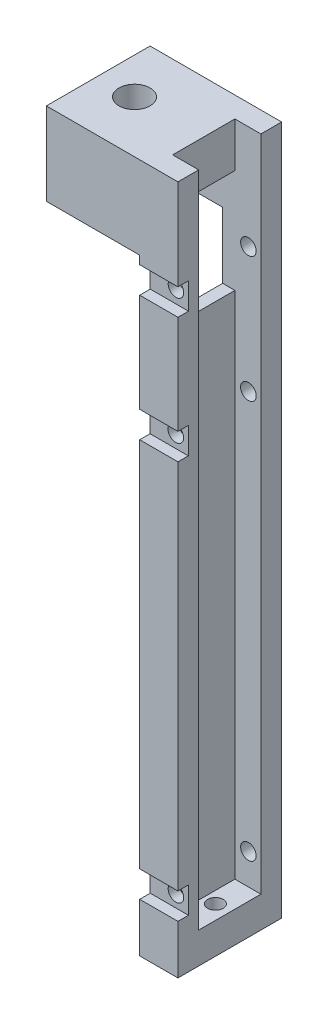
ISO-10303-21;
HEADER;
FILE_DESCRIPTION(('STEP AP214'),'2;1');
FILE_NAME('part.step','',(''),(''),'','','');
FILE_SCHEMA(('AUTOMOTIVE_DESIGN { 1 0 10303 214 1 1 1 1 }'));
ENDSEC;
DATA;
#1=APPLICATION_CONTEXT('core data for automotive mechanical design processes');
#2=APPLICATION_PROTOCOL_DEFINITION('international standard','automotive_design',2000,#1);
#3=PRODUCT_CONTEXT('',#1,'mechanical');
#4=PRODUCT('Part','Part','',(#3));
#5=PRODUCT_RELATED_PRODUCT_CATEGORY('part','',(#4));
#6=PRODUCT_DEFINITION_FORMATION('','',#4);
#7=PRODUCT_DEFINITION_CONTEXT('part definition',#1,'design');
#8=PRODUCT_DEFINITION('design','',#6,#7);
#9=PRODUCT_DEFINITION_SHAPE('','',#8);
#10=(LENGTH_UNIT() NAMED_UNIT(*) SI_UNIT(.MILLI.,.METRE.));
#11=(NAMED_UNIT(*) PLANE_ANGLE_UNIT() SI_UNIT($,.RADIAN.));
#12=(NAMED_UNIT(*) SI_UNIT($,.STERADIAN.) SOLID_ANGLE_UNIT());
#13=UNCERTAINTY_MEASURE_WITH_UNIT(LENGTH_MEASURE(1.E-05),#10,'distance_accuracy_value','');
#14=(GEOMETRIC_REPRESENTATION_CONTEXT(3) GLOBAL_UNCERTAINTY_ASSIGNED_CONTEXT((#13)) GLOBAL_UNIT_ASSIGNED_CONTEXT((#10,
#11,#12)) REPRESENTATION_CONTEXT('',''));
#15=CARTESIAN_POINT('',(0.,0.,0.));
#16=DIRECTION('',(0.,0.,1.));
#17=DIRECTION('',(1.,0.,0.));
#18=AXIS2_PLACEMENT_3D('',#15,#16,#17);
#19=CARTESIAN_POINT('',(-13.,53.147,10.));
#20=DIRECTION('',(0.,1.,0.));
#21=DIRECTION('',(0.,0.,1.));
#22=AXIS2_PLACEMENT_3D('',#19,#20,#21);
#23=PLANE('',#22);
#24=CARTESIAN_POINT('',(-9.5,53.147,5.));
#25=DIRECTION('',(0.,1.,0.));
#26=DIRECTION('',(0.,0.,1.));
#27=AXIS2_PLACEMENT_3D('',#24,#25,#26);
#28=CIRCLE('',#27,1.5);
#29=CARTESIAN_POINT('',(-9.5,53.147,6.5));
#30=VERTEX_POINT('',#29);
#31=EDGE_CURVE('E297',#30,#30,#28,.T.);
#32=ORIENTED_EDGE('',*,*,#31,.T.);
#33=EDGE_LOOP('',(#32));
#34=FACE_BOUND('',#33,.T.);
#35=DIRECTION('',(0.,0.,1.));
#36=VECTOR('',#35,1.);
#37=CARTESIAN_POINT('',(-13.,53.147,10.));
#38=LINE('',#37,#36);
#39=CARTESIAN_POINT('',(-13.,53.147,2.));
#40=VERTEX_POINT('',#39);
#41=CARTESIAN_POINT('',(-13.,53.147,8.));
#42=VERTEX_POINT('',#41);
#43=EDGE_CURVE('E256',#40,#42,#38,.T.);
#44=ORIENTED_EDGE('',*,*,#43,.F.);
#45=DIRECTION('',(1.,0.,0.));
#46=VECTOR('',#45,1.);
#47=CARTESIAN_POINT('',(-12.82,53.147,2.));
#48=LINE('',#47,#46);
#49=CARTESIAN_POINT('',(-2.82,53.147,2.));
#50=VERTEX_POINT('',#49);
#51=EDGE_CURVE('E56',#40,#50,#48,.T.);
#52=ORIENTED_EDGE('',*,*,#51,.T.);
#53=DIRECTION('',(0.,0.,1.));
#54=VECTOR('',#53,1.);
#55=CARTESIAN_POINT('',(-2.82,53.147,8.));
#56=LINE('',#55,#54);
#57=CARTESIAN_POINT('',(-2.82,53.147,8.));
#58=VERTEX_POINT('',#57);
#59=EDGE_CURVE('E454',#50,#58,#56,.T.);
#60=ORIENTED_EDGE('',*,*,#59,.T.);
#61=DIRECTION('',(1.,0.,0.));
#62=VECTOR('',#61,1.);
#63=CARTESIAN_POINT('',(-12.82,53.147,8.));
#64=LINE('',#63,#62);
#65=EDGE_CURVE('E458',#42,#58,#64,.T.);
#66=ORIENTED_EDGE('',*,*,#65,.F.);
#67=EDGE_LOOP('',(#44,#52,#60,#66));
#68=FACE_BOUND('',#67,.T.);
#69=ADVANCED_FACE('F34',(#34,#68),#23,.F.);
#70=CARTESIAN_POINT('',(-4.,17.5,10.));
#71=DIRECTION('',(1.,0.,0.));
#72=DIRECTION('',(0.,1.,0.));
#73=AXIS2_PLACEMENT_3D('',#70,#71,#72);
#74=PLANE('',#73);
#75=DIRECTION('',(0.,-1.,0.));
#76=VECTOR('',#75,1.);
#77=CARTESIAN_POINT('',(-4.,17.5,0.));
#78=LINE('',#77,#76);
#79=CARTESIAN_POINT('',(-4.00000000000001,49.497,0.));
#80=VERTEX_POINT('',#79);
#81=CARTESIAN_POINT('',(-4.,-9.02,0.));
#82=VERTEX_POINT('',#81);
#83=EDGE_CURVE('E280',#80,#82,#78,.T.);
#84=ORIENTED_EDGE('',*,*,#83,.T.);
#85=DIRECTION('',(0.,0.,-1.));
#86=VECTOR('',#85,1.);
#87=CARTESIAN_POINT('',(-4.,-9.02,0.));
#88=LINE('',#87,#86);
#89=CARTESIAN_POINT('',(-4.,-9.02,10.));
#90=VERTEX_POINT('',#89);
#91=EDGE_CURVE('E243',#90,#82,#88,.T.);
#92=ORIENTED_EDGE('',*,*,#91,.F.);
#93=DIRECTION('',(0.,-1.,0.));
#94=VECTOR('',#93,1.);
#95=CARTESIAN_POINT('',(-4.,17.5,10.));
#96=LINE('',#95,#94);
#97=CARTESIAN_POINT('',(-4.,-4.29,10.));
#98=VERTEX_POINT('',#97);
#99=EDGE_CURVE('E293',#98,#90,#96,.T.);
#100=ORIENTED_EDGE('',*,*,#99,.F.);
#101=DIRECTION('',(0.,0.,1.));
#102=VECTOR('',#101,1.);
#103=CARTESIAN_POINT('',(-4.,-4.29,8.984));
#104=LINE('',#103,#102);
#105=CARTESIAN_POINT('',(-4.,-4.29,8.984));
#106=VERTEX_POINT('',#105);
#107=EDGE_CURVE('E356',#106,#98,#104,.T.);
#108=ORIENTED_EDGE('',*,*,#107,.F.);
#109=DIRECTION('',(0.,-1.,0.));
#110=VECTOR('',#109,1.);
#111=CARTESIAN_POINT('',(-4.,-1.75,8.984));
#112=LINE('',#111,#110);
#113=CARTESIAN_POINT('',(-4.,-1.75,8.984));
#114=VERTEX_POINT('',#113);
#115=EDGE_CURVE('E345',#114,#106,#112,.T.);
#116=ORIENTED_EDGE('',*,*,#115,.F.);
#117=DIRECTION('',(0.,0.,1.));
#118=VECTOR('',#117,1.);
#119=CARTESIAN_POINT('',(-4.,-1.75,8.984));
#120=LINE('',#119,#118);
#121=CARTESIAN_POINT('',(-4.,-1.75,10.));
#122=VERTEX_POINT('',#121);
#123=EDGE_CURVE('E352',#114,#122,#120,.T.);
#124=ORIENTED_EDGE('',*,*,#123,.T.);
#125=CARTESIAN_POINT('',(-4.,34.0850485923421,10.));
#126=VERTEX_POINT('',#125);
#127=EDGE_CURVE('E295',#126,#122,#96,.T.);
#128=ORIENTED_EDGE('',*,*,#127,.F.);
#129=DIRECTION('',(0.,0.,1.));
#130=VECTOR('',#129,1.);
#131=CARTESIAN_POINT('',(-4.,34.0850485923421,9.));
#132=LINE('',#131,#130);
#133=CARTESIAN_POINT('',(-4.,34.0850485923421,9.));
#134=VERTEX_POINT('',#133);
#135=EDGE_CURVE('E338',#134,#126,#132,.T.);
#136=ORIENTED_EDGE('',*,*,#135,.F.);
#137=DIRECTION('',(0.,-1.,0.));
#138=VECTOR('',#137,1.);
#139=CARTESIAN_POINT('',(-4.,36.6250485923421,9.));
#140=LINE('',#139,#138);
#141=CARTESIAN_POINT('',(-4.,36.6250485923421,9.));
#142=VERTEX_POINT('',#141);
#143=EDGE_CURVE('E327',#142,#134,#140,.T.);
#144=ORIENTED_EDGE('',*,*,#143,.F.);
#145=DIRECTION('',(0.,0.,1.));
#146=VECTOR('',#145,1.);
#147=CARTESIAN_POINT('',(-4.,36.6250485923421,9.));
#148=LINE('',#147,#146);
#149=CARTESIAN_POINT('',(-4.,36.6250485923421,10.));
#150=VERTEX_POINT('',#149);
#151=EDGE_CURVE('E334',#142,#150,#148,.T.);
#152=ORIENTED_EDGE('',*,*,#151,.T.);
#153=CARTESIAN_POINT('',(-4.,46.1567314564562,10.));
#154=VERTEX_POINT('',#153);
#155=EDGE_CURVE('E291',#154,#150,#96,.T.);
#156=ORIENTED_EDGE('',*,*,#155,.F.);
#157=DIRECTION('',(0.,0.,1.));
#158=VECTOR('',#157,1.);
#159=CARTESIAN_POINT('',(-4.,46.1567314564562,8.984));
#160=LINE('',#159,#158);
#161=CARTESIAN_POINT('',(-4.,46.1567314564562,8.984));
#162=VERTEX_POINT('',#161);
#163=EDGE_CURVE('E370',#162,#154,#160,.T.);
#164=ORIENTED_EDGE('',*,*,#163,.F.);
#165=DIRECTION('',(0.,-1.,0.));
#166=VECTOR('',#165,1.);
#167=CARTESIAN_POINT('',(-4.,47.4267314564562,8.984));
#168=LINE('',#167,#166);
#169=CARTESIAN_POINT('',(-4.,48.6967314564562,8.984));
#170=VERTEX_POINT('',#169);
#171=EDGE_CURVE('E361',#170,#162,#168,.T.);
#172=ORIENTED_EDGE('',*,*,#171,.F.);
#173=DIRECTION('',(0.,0.,1.));
#174=VECTOR('',#173,1.);
#175=CARTESIAN_POINT('',(-4.,48.6967314564562,8.984));
#176=LINE('',#175,#174);
#177=CARTESIAN_POINT('',(-4.,48.6967314564562,10.));
#178=VERTEX_POINT('',#177);
#179=EDGE_CURVE('E248',#170,#178,#176,.T.);
#180=ORIENTED_EDGE('',*,*,#179,.T.);
#181=CARTESIAN_POINT('',(-4.,49.497,10.));
#182=VERTEX_POINT('',#181);
#183=EDGE_CURVE('E42',#182,#178,#96,.T.);
#184=ORIENTED_EDGE('',*,*,#183,.F.);
#185=DIRECTION('',(0.,0.,1.));
#186=VECTOR('',#185,1.);
#187=CARTESIAN_POINT('',(-4.,49.497,10.));
#188=LINE('',#187,#186);
#189=CARTESIAN_POINT('',(-4.,49.497,8.));
#190=VERTEX_POINT('',#189);
#191=EDGE_CURVE('E445',#190,#182,#188,.T.);
#192=ORIENTED_EDGE('',*,*,#191,.F.);
#193=DIRECTION('',(0.,-1.,0.));
#194=VECTOR('',#193,1.);
#195=CARTESIAN_POINT('',(-4.,17.5,7.99999999999999));
#196=LINE('',#195,#194);
#197=CARTESIAN_POINT('',(-4.00000000000001,43.147,8.));
#198=VERTEX_POINT('',#197);
#199=EDGE_CURVE('E468',#190,#198,#196,.T.);
#200=ORIENTED_EDGE('',*,*,#199,.T.);
#201=DIRECTION('',(0.,0.,-1.));
#202=VECTOR('',#201,1.);
#203=CARTESIAN_POINT('',(-4.00000000000001,43.147,10.));
#204=LINE('',#203,#202);
#205=CARTESIAN_POINT('',(-4.00000000000001,43.147,2.));
#206=VERTEX_POINT('',#205);
#207=EDGE_CURVE('E470',#198,#206,#204,.T.);
#208=ORIENTED_EDGE('',*,*,#207,.T.);
#209=DIRECTION('',(0.,1.,0.));
#210=VECTOR('',#209,1.);
#211=CARTESIAN_POINT('',(-4.,17.5,2.));
#212=LINE('',#211,#210);
#213=CARTESIAN_POINT('',(-4.,49.497,2.));
#214=VERTEX_POINT('',#213);
#215=EDGE_CURVE('E460',#206,#214,#212,.T.);
#216=ORIENTED_EDGE('',*,*,#215,.T.);
#217=DIRECTION('',(0.,0.,1.));
#218=VECTOR('',#217,1.);
#219=CARTESIAN_POINT('',(-4.,49.497,2.));
#220=LINE('',#219,#218);
#221=EDGE_CURVE('E436',#80,#214,#220,.T.);
#222=ORIENTED_EDGE('',*,*,#221,.F.);
#223=EDGE_LOOP('',(#84,#92,#100,#108,#116,#124,#128,#136,#144,#152,#156,#164,#172,#180,#184,
#192,#200,#208,#216,#222));
#224=FACE_BOUND('',#223,.T.);
#225=ADVANCED_FACE('F36',(#224),#74,.F.);
#226=CARTESIAN_POINT('',(-2.82,0.,8.));
#227=DIRECTION('',(1.,0.,0.));
#228=DIRECTION('',(0.,0.,-1.));
#229=AXIS2_PLACEMENT_3D('',#226,#227,#228);
#230=PLANE('',#229);
#231=ORIENTED_EDGE('',*,*,#59,.F.);
#232=DIRECTION('',(0.,1.,0.));
#233=VECTOR('',#232,1.);
#234=CARTESIAN_POINT('',(-2.82,0.,2.));
#235=LINE('',#234,#233);
#236=CARTESIAN_POINT('',(-2.82,57.465,2.));
#237=VERTEX_POINT('',#236);
#238=EDGE_CURVE('E277',#50,#237,#235,.T.);
#239=ORIENTED_EDGE('',*,*,#238,.T.);
#240=DIRECTION('',(0.,0.,-1.));
#241=VECTOR('',#240,1.);
#242=CARTESIAN_POINT('',(-2.82,57.465,2.));
#243=LINE('',#242,#241);
#244=CARTESIAN_POINT('',(-2.82,57.465,8.));
#245=VERTEX_POINT('',#244);
#246=EDGE_CURVE('E263',#245,#237,#243,.T.);
#247=ORIENTED_EDGE('',*,*,#246,.F.);
#248=DIRECTION('',(0.,-1.,0.));
#249=VECTOR('',#248,1.);
#250=CARTESIAN_POINT('',(-2.82,21.5,8.));
#251=LINE('',#250,#249);
#252=EDGE_CURVE('E274',#245,#58,#251,.T.);
#253=ORIENTED_EDGE('',*,*,#252,.T.);
#254=EDGE_LOOP('',(#231,#239,#247,#253));
#255=FACE_BOUND('',#254,.T.);
#256=ADVANCED_FACE('F516',(#255),#230,.T.);
#257=CARTESIAN_POINT('',(-0.819999999999999,21.5,10.));
#258=DIRECTION('',(0.,0.,1.));
#259=DIRECTION('',(1.,0.,0.));
#260=AXIS2_PLACEMENT_3D('',#257,#258,#259);
#261=PLANE('',#260);
#262=DIRECTION('',(0.,1.,0.));
#263=VECTOR('',#262,1.);
#264=CARTESIAN_POINT('',(-0.311999999999999,-9.01999999999999,10.));
#265=LINE('',#264,#263);
#266=CARTESIAN_POINT('',(-0.311999999999999,36.6250485923421,10.));
#267=VERTEX_POINT('',#266);
#268=CARTESIAN_POINT('',(-0.311999999999999,46.1567314564562,10.));
#269=VERTEX_POINT('',#268);
#270=EDGE_CURVE('E388',#267,#269,#265,.T.);
#271=ORIENTED_EDGE('',*,*,#270,.T.);
#272=DIRECTION('',(1.,0.,0.));
#273=VECTOR('',#272,1.);
#274=CARTESIAN_POINT('',(0.0690000000000009,46.1567314564562,10.));
#275=LINE('',#274,#273);
#276=EDGE_CURVE('E358',#154,#269,#275,.T.);
#277=ORIENTED_EDGE('',*,*,#276,.F.);
#278=ORIENTED_EDGE('',*,*,#155,.T.);
#279=DIRECTION('',(-1.,0.,0.));
#280=VECTOR('',#279,1.);
#281=CARTESIAN_POINT('',(0.0690000000000009,36.6250485923421,10.));
#282=LINE('',#281,#280);
#283=EDGE_CURVE('E324',#267,#150,#282,.T.);
#284=ORIENTED_EDGE('',*,*,#283,.F.);
#285=EDGE_LOOP('',(#271,#277,#278,#284));
#286=FACE_BOUND('',#285,.T.);
#287=ADVANCED_FACE('F386',(#286),#261,.T.);
#288=CARTESIAN_POINT('',(-0.311999999999999,-9.01999999999999,10.));
#289=VERTEX_POINT('',#288);
#290=CARTESIAN_POINT('',(-0.311999999999999,-4.29,10.));
#291=VERTEX_POINT('',#290);
#292=EDGE_CURVE('E223',#289,#291,#265,.T.);
#293=ORIENTED_EDGE('',*,*,#292,.T.);
#294=DIRECTION('',(1.,0.,0.));
#295=VECTOR('',#294,1.);
#296=CARTESIAN_POINT('',(-4.,-4.29,10.));
#297=LINE('',#296,#295);
#298=EDGE_CURVE('E346',#98,#291,#297,.T.);
#299=ORIENTED_EDGE('',*,*,#298,.F.);
#300=ORIENTED_EDGE('',*,*,#99,.T.);
#301=DIRECTION('',(-1.,0.,0.));
#302=VECTOR('',#301,1.);
#303=CARTESIAN_POINT('',(-4.,-9.02,10.));
#304=LINE('',#303,#302);
#305=EDGE_CURVE('E244',#289,#90,#304,.T.);
#306=ORIENTED_EDGE('',*,*,#305,.F.);
#307=EDGE_LOOP('',(#293,#299,#300,#306));
#308=FACE_BOUND('',#307,.T.);
#309=ADVANCED_FACE('F735',(#308),#261,.T.);
#310=CARTESIAN_POINT('',(-0.311999999999999,48.6967314564562,10.));
#311=VERTEX_POINT('',#310);
#312=CARTESIAN_POINT('',(-0.311999999999999,57.465,10.));
#313=VERTEX_POINT('',#312);
#314=EDGE_CURVE('E239',#311,#313,#265,.T.);
#315=ORIENTED_EDGE('',*,*,#314,.T.);
#316=DIRECTION('',(1.,0.,0.));
#317=VECTOR('',#316,1.);
#318=CARTESIAN_POINT('',(-0.819999999999999,57.465,10.));
#319=LINE('',#318,#317);
#320=CARTESIAN_POINT('',(-13.,57.465,10.));
#321=VERTEX_POINT('',#320);
#322=EDGE_CURVE('E270',#321,#313,#319,.T.);
#323=ORIENTED_EDGE('',*,*,#322,.F.);
#324=DIRECTION('',(0.,1.,0.));
#325=VECTOR('',#324,1.);
#326=CARTESIAN_POINT('',(-13.,57.465,10.));
#327=LINE('',#326,#325);
#328=CARTESIAN_POINT('',(-13.,49.497,10.));
#329=VERTEX_POINT('',#328);
#330=EDGE_CURVE('E258',#329,#321,#327,.T.);
#331=ORIENTED_EDGE('',*,*,#330,.F.);
#332=DIRECTION('',(-1.,0.,0.));
#333=VECTOR('',#332,1.);
#334=CARTESIAN_POINT('',(-13.,49.497,10.));
#335=LINE('',#334,#333);
#336=EDGE_CURVE('E399',#182,#329,#335,.T.);
#337=ORIENTED_EDGE('',*,*,#336,.F.);
#338=ORIENTED_EDGE('',*,*,#183,.T.);
#339=DIRECTION('',(-1.,0.,0.));
#340=VECTOR('',#339,1.);
#341=CARTESIAN_POINT('',(-4.,48.6967314564562,10.));
#342=LINE('',#341,#340);
#343=EDGE_CURVE('E365',#311,#178,#342,.T.);
#344=ORIENTED_EDGE('',*,*,#343,.F.);
#345=EDGE_LOOP('',(#315,#323,#331,#337,#338,#344));
#346=FACE_BOUND('',#345,.T.);
#347=ADVANCED_FACE('F397',(#346),#261,.T.);
#348=CARTESIAN_POINT('',(-0.311999999999999,-1.75,10.));
#349=VERTEX_POINT('',#348);
#350=CARTESIAN_POINT('',(-0.311999999999999,34.0850485923421,10.));
#351=VERTEX_POINT('',#350);
#352=EDGE_CURVE('E978',#349,#351,#265,.T.);
#353=ORIENTED_EDGE('',*,*,#352,.T.);
#354=DIRECTION('',(1.,0.,0.));
#355=VECTOR('',#354,1.);
#356=CARTESIAN_POINT('',(-4.,34.0850485923421,10.));
#357=LINE('',#356,#355);
#358=EDGE_CURVE('E328',#126,#351,#357,.T.);
#359=ORIENTED_EDGE('',*,*,#358,.F.);
#360=ORIENTED_EDGE('',*,*,#127,.T.);
#361=DIRECTION('',(-1.,0.,0.));
#362=VECTOR('',#361,1.);
#363=CARTESIAN_POINT('',(0.0690000000000006,-1.75,10.));
#364=LINE('',#363,#362);
#365=EDGE_CURVE('E340',#349,#122,#364,.T.);
#366=ORIENTED_EDGE('',*,*,#365,.F.);
#367=EDGE_LOOP('',(#353,#359,#360,#366));
#368=FACE_BOUND('',#367,.T.);
#369=ADVANCED_FACE('F537',(#368),#261,.T.);
#370=CARTESIAN_POINT('',(-0.819999999999999,21.5,0.));
#371=DIRECTION('',(0.,0.,1.));
#372=DIRECTION('',(1.,0.,0.));
#373=AXIS2_PLACEMENT_3D('',#370,#371,#372);
#374=PLANE('',#373);
#375=DIRECTION('',(-1.,0.,0.));
#376=VECTOR('',#375,1.);
#377=CARTESIAN_POINT('',(-4.,57.465,0.));
#378=LINE('',#377,#376);
#379=CARTESIAN_POINT('',(-0.311999999999999,57.465,0.));
#380=VERTEX_POINT('',#379);
#381=CARTESIAN_POINT('',(-13.,57.465,0.));
#382=VERTEX_POINT('',#381);
#383=EDGE_CURVE('E238',#380,#382,#378,.T.);
#384=ORIENTED_EDGE('',*,*,#383,.F.);
#385=DIRECTION('',(0.,1.,0.));
#386=VECTOR('',#385,1.);
#387=CARTESIAN_POINT('',(-0.311999999999999,-9.01999999999999,0.));
#388=LINE('',#387,#386);
#389=CARTESIAN_POINT('',(-0.311999999999999,-9.01999999999999,0.));
#390=VERTEX_POINT('',#389);
#391=EDGE_CURVE('E220',#390,#380,#388,.T.);
#392=ORIENTED_EDGE('',*,*,#391,.F.);
#393=DIRECTION('',(1.,0.,0.));
#394=VECTOR('',#393,1.);
#395=CARTESIAN_POINT('',(0.0690000000000009,-9.02,0.));
#396=LINE('',#395,#394);
#397=EDGE_CURVE('E235',#82,#390,#396,.T.);
#398=ORIENTED_EDGE('',*,*,#397,.F.);
#399=ORIENTED_EDGE('',*,*,#83,.F.);
#400=DIRECTION('',(1.,0.,0.));
#401=VECTOR('',#400,1.);
#402=CARTESIAN_POINT('',(-4.00000000000001,49.497,0.));
#403=LINE('',#402,#401);
#404=CARTESIAN_POINT('',(-13.,49.497,0.));
#405=VERTEX_POINT('',#404);
#406=EDGE_CURVE('E434',#405,#80,#403,.T.);
#407=ORIENTED_EDGE('',*,*,#406,.F.);
#408=DIRECTION('',(0.,-1.,0.));
#409=VECTOR('',#408,1.);
#410=CARTESIAN_POINT('',(-13.,53.147,0.));
#411=LINE('',#410,#409);
#412=EDGE_CURVE('E254',#382,#405,#411,.T.);
#413=ORIENTED_EDGE('',*,*,#412,.F.);
#414=EDGE_LOOP('',(#384,#392,#398,#399,#407,#413));
#415=FACE_BOUND('',#414,.T.);
#416=CARTESIAN_POINT('',(-1.51849999999999,-3.05,0.));
#417=DIRECTION('',(0.,0.,1.));
#418=DIRECTION('',(1.,0.,0.));
#419=AXIS2_PLACEMENT_3D('',#416,#417,#418);
#420=CIRCLE('',#419,0.75);
#421=CARTESIAN_POINT('',(-0.768499999999994,-3.05,0.));
#422=VERTEX_POINT('',#421);
#423=EDGE_CURVE('E482',#422,#422,#420,.T.);
#424=ORIENTED_EDGE('',*,*,#423,.T.);
#425=EDGE_LOOP('',(#424));
#426=FACE_BOUND('',#425,.T.);
#427=CARTESIAN_POINT('',(-1.5185,47.4567314564562,0.));
#428=DIRECTION('',(0.,0.,1.));
#429=DIRECTION('',(1.,0.,0.));
#430=AXIS2_PLACEMENT_3D('',#427,#428,#429);
#431=CIRCLE('',#430,0.75);
#432=CARTESIAN_POINT('',(-0.768499999999999,47.4567314564562,0.));
#433=VERTEX_POINT('',#432);
#434=EDGE_CURVE('E307',#433,#433,#431,.T.);
#435=ORIENTED_EDGE('',*,*,#434,.T.);
#436=EDGE_LOOP('',(#435));
#437=FACE_BOUND('',#436,.T.);
#438=CARTESIAN_POINT('',(-1.5185,35.3550485923421,0.));
#439=DIRECTION('',(0.,0.,1.));
#440=DIRECTION('',(1.,0.,0.));
#441=AXIS2_PLACEMENT_3D('',#438,#439,#440);
#442=CIRCLE('',#441,0.755649999999995);
#443=CARTESIAN_POINT('',(-0.762850000000004,35.3550485923421,0.));
#444=VERTEX_POINT('',#443);
#445=EDGE_CURVE('E321',#444,#444,#442,.T.);
#446=ORIENTED_EDGE('',*,*,#445,.T.);
#447=EDGE_LOOP('',(#446));
#448=FACE_BOUND('',#447,.T.);
#449=ADVANCED_FACE('F232',(#415,#426,#437,#448),#374,.F.);
#450=CARTESIAN_POINT('',(-2.82,21.5,8.));
#451=DIRECTION('',(0.,0.,1.));
#452=DIRECTION('',(1.,0.,0.));
#453=AXIS2_PLACEMENT_3D('',#450,#451,#452);
#454=PLANE('',#453);
#455=CARTESIAN_POINT('',(-1.51849999999999,-3.05,8.));
#456=DIRECTION('',(0.,0.,1.));
#457=DIRECTION('',(1.,0.,0.));
#458=AXIS2_PLACEMENT_3D('',#455,#456,#457);
#459=CIRCLE('',#458,0.75);
#460=CARTESIAN_POINT('',(-0.768499999999994,-3.05,8.));
#461=VERTEX_POINT('',#460);
#462=EDGE_CURVE('E479',#461,#461,#459,.T.);
#463=ORIENTED_EDGE('',*,*,#462,.T.);
#464=EDGE_LOOP('',(#463));
#465=FACE_BOUND('',#464,.T.);
#466=CARTESIAN_POINT('',(-1.5185,47.4567314564562,8.));
#467=DIRECTION('',(0.,0.,1.));
#468=DIRECTION('',(1.,0.,0.));
#469=AXIS2_PLACEMENT_3D('',#466,#467,#468);
#470=CIRCLE('',#469,0.75);
#471=CARTESIAN_POINT('',(-0.768499999999999,47.4567314564562,8.));
#472=VERTEX_POINT('',#471);
#473=EDGE_CURVE('E312',#472,#472,#470,.T.);
#474=ORIENTED_EDGE('',*,*,#473,.T.);
#475=EDGE_LOOP('',(#474));
#476=FACE_BOUND('',#475,.T.);
#477=CARTESIAN_POINT('',(-1.5185,35.3550485923421,8.));
#478=DIRECTION('',(0.,0.,1.));
#479=DIRECTION('',(1.,0.,0.));
#480=AXIS2_PLACEMENT_3D('',#477,#478,#479);
#481=CIRCLE('',#480,0.755649999999995);
#482=CARTESIAN_POINT('',(-0.762850000000004,35.3550485923421,8.));
#483=VERTEX_POINT('',#482);
#484=EDGE_CURVE('E318',#483,#483,#481,.T.);
#485=ORIENTED_EDGE('',*,*,#484,.T.);
#486=EDGE_LOOP('',(#485));
#487=FACE_BOUND('',#486,.T.);
#488=DIRECTION('',(-1.,0.,0.));
#489=VECTOR('',#488,1.);
#490=CARTESIAN_POINT('',(-2.82,57.465,8.));
#491=LINE('',#490,#489);
#492=CARTESIAN_POINT('',(-0.311999999999999,57.465,8.));
#493=VERTEX_POINT('',#492);
#494=EDGE_CURVE('E261',#493,#245,#491,.T.);
#495=ORIENTED_EDGE('',*,*,#494,.F.);
#496=DIRECTION('',(0.,-1.,0.));
#497=VECTOR('',#496,1.);
#498=CARTESIAN_POINT('',(-0.311999999999999,21.5,8.));
#499=LINE('',#498,#497);
#500=CARTESIAN_POINT('',(-0.311999999999999,-6.02,8.));
#501=VERTEX_POINT('',#500);
#502=EDGE_CURVE('E997',#493,#501,#499,.T.);
#503=ORIENTED_EDGE('',*,*,#502,.T.);
#504=DIRECTION('',(-1.,0.,0.));
#505=VECTOR('',#504,1.);
#506=CARTESIAN_POINT('',(-2.82,-6.02,8.));
#507=LINE('',#506,#505);
#508=CARTESIAN_POINT('',(-2.82,-6.02,8.));
#509=VERTEX_POINT('',#508);
#510=EDGE_CURVE('E426',#501,#509,#507,.T.);
#511=ORIENTED_EDGE('',*,*,#510,.T.);
#512=CARTESIAN_POINT('',(-2.82,43.147,8.));
#513=VERTEX_POINT('',#512);
#514=EDGE_CURVE('E273',#513,#509,#251,.T.);
#515=ORIENTED_EDGE('',*,*,#514,.F.);
#516=DIRECTION('',(1.,0.,0.));
#517=VECTOR('',#516,1.);
#518=CARTESIAN_POINT('',(-12.82,43.147,8.));
#519=LINE('',#518,#517);
#520=EDGE_CURVE('E457',#198,#513,#519,.T.);
#521=ORIENTED_EDGE('',*,*,#520,.F.);
#522=ORIENTED_EDGE('',*,*,#199,.F.);
#523=DIRECTION('',(1.,0.,0.));
#524=VECTOR('',#523,1.);
#525=CARTESIAN_POINT('',(-4.,49.497,8.));
#526=LINE('',#525,#524);
#527=CARTESIAN_POINT('',(-13.,49.497,8.));
#528=VERTEX_POINT('',#527);
#529=EDGE_CURVE('E443',#528,#190,#526,.T.);
#530=ORIENTED_EDGE('',*,*,#529,.F.);
#531=DIRECTION('',(0.,1.,0.));
#532=VECTOR('',#531,1.);
#533=CARTESIAN_POINT('',(-13.,49.497,8.));
#534=LINE('',#533,#532);
#535=EDGE_CURVE('E448',#528,#42,#534,.T.);
#536=ORIENTED_EDGE('',*,*,#535,.T.);
#537=ORIENTED_EDGE('',*,*,#65,.T.);
#538=ORIENTED_EDGE('',*,*,#252,.F.);
#539=EDGE_LOOP('',(#495,#503,#511,#515,#521,#522,#530,#536,#537,#538));
#540=FACE_BOUND('',#539,.T.);
#541=ADVANCED_FACE('F493',(#465,#476,#487,#540),#454,.F.);
#542=CARTESIAN_POINT('',(-2.82,0.,2.));
#543=DIRECTION('',(0.,0.,-1.));
#544=DIRECTION('',(-1.,0.,0.));
#545=AXIS2_PLACEMENT_3D('',#542,#543,#544);
#546=PLANE('',#545);
#547=CARTESIAN_POINT('',(-1.51849999999999,-3.05,2.));
#548=DIRECTION('',(0.,0.,-1.));
#549=DIRECTION('',(-1.,0.,0.));
#550=AXIS2_PLACEMENT_3D('',#547,#548,#549);
#551=CIRCLE('',#550,0.75);
#552=CARTESIAN_POINT('',(-2.26849999999999,-3.05,2.));
#553=VERTEX_POINT('',#552);
#554=EDGE_CURVE('E476',#553,#553,#551,.T.);
#555=ORIENTED_EDGE('',*,*,#554,.T.);
#556=EDGE_LOOP('',(#555));
#557=FACE_BOUND('',#556,.T.);
#558=CARTESIAN_POINT('',(-1.5185,47.4567314564562,2.));
#559=DIRECTION('',(0.,0.,-1.));
#560=DIRECTION('',(-1.,0.,0.));
#561=AXIS2_PLACEMENT_3D('',#558,#559,#560);
#562=CIRCLE('',#561,0.75);
#563=CARTESIAN_POINT('',(-2.2685,47.4567314564562,2.));
#564=VERTEX_POINT('',#563);
#565=EDGE_CURVE('E488',#564,#564,#562,.T.);
#566=ORIENTED_EDGE('',*,*,#565,.T.);
#567=EDGE_LOOP('',(#566));
#568=FACE_BOUND('',#567,.T.);
#569=CARTESIAN_POINT('',(-1.5185,35.3550485923421,2.));
#570=DIRECTION('',(0.,0.,-1.));
#571=DIRECTION('',(-1.,0.,0.));
#572=AXIS2_PLACEMENT_3D('',#569,#570,#571);
#573=CIRCLE('',#572,0.755649999999995);
#574=CARTESIAN_POINT('',(-2.27414999999999,35.3550485923421,2.));
#575=VERTEX_POINT('',#574);
#576=EDGE_CURVE('E304',#575,#575,#573,.T.);
#577=ORIENTED_EDGE('',*,*,#576,.T.);
#578=EDGE_LOOP('',(#577));
#579=FACE_BOUND('',#578,.T.);
#580=DIRECTION('',(1.,0.,0.));
#581=VECTOR('',#580,1.);
#582=CARTESIAN_POINT('',(-2.82,-6.02,2.));
#583=LINE('',#582,#581);
#584=CARTESIAN_POINT('',(-2.82,-6.02,2.));
#585=VERTEX_POINT('',#584);
#586=CARTESIAN_POINT('',(-0.311999999999999,-6.02,2.));
#587=VERTEX_POINT('',#586);
#588=EDGE_CURVE('E423',#585,#587,#583,.T.);
#589=ORIENTED_EDGE('',*,*,#588,.T.);
#590=DIRECTION('',(0.,1.,0.));
#591=VECTOR('',#590,1.);
#592=CARTESIAN_POINT('',(-0.311999999999999,0.,2.));
#593=LINE('',#592,#591);
#594=CARTESIAN_POINT('',(-0.311999999999999,57.465,2.));
#595=VERTEX_POINT('',#594);
#596=EDGE_CURVE('E48',#587,#595,#593,.T.);
#597=ORIENTED_EDGE('',*,*,#596,.T.);
#598=DIRECTION('',(1.,0.,0.));
#599=VECTOR('',#598,1.);
#600=CARTESIAN_POINT('',(-0.819999999999999,57.465,2.));
#601=LINE('',#600,#599);
#602=EDGE_CURVE('E266',#237,#595,#601,.T.);
#603=ORIENTED_EDGE('',*,*,#602,.F.);
#604=ORIENTED_EDGE('',*,*,#238,.F.);
#605=ORIENTED_EDGE('',*,*,#51,.F.);
#606=DIRECTION('',(0.,1.,0.));
#607=VECTOR('',#606,1.);
#608=CARTESIAN_POINT('',(-13.,49.497,2.));
#609=LINE('',#608,#607);
#610=CARTESIAN_POINT('',(-13.,49.497,2.));
#611=VERTEX_POINT('',#610);
#612=EDGE_CURVE('E438',#611,#40,#609,.T.);
#613=ORIENTED_EDGE('',*,*,#612,.F.);
#614=DIRECTION('',(-1.,0.,0.));
#615=VECTOR('',#614,1.);
#616=CARTESIAN_POINT('',(-4.,49.497,2.));
#617=LINE('',#616,#615);
#618=EDGE_CURVE('E428',#214,#611,#617,.T.);
#619=ORIENTED_EDGE('',*,*,#618,.F.);
#620=ORIENTED_EDGE('',*,*,#215,.F.);
#621=DIRECTION('',(1.,0.,0.));
#622=VECTOR('',#621,1.);
#623=CARTESIAN_POINT('',(-12.82,43.147,2.));
#624=LINE('',#623,#622);
#625=CARTESIAN_POINT('',(-2.82,43.147,2.));
#626=VERTEX_POINT('',#625);
#627=EDGE_CURVE('E462',#206,#626,#624,.T.);
#628=ORIENTED_EDGE('',*,*,#627,.T.);
#629=EDGE_CURVE('E278',#585,#626,#235,.T.);
#630=ORIENTED_EDGE('',*,*,#629,.F.);
#631=EDGE_LOOP('',(#589,#597,#603,#604,#605,#613,#619,#620,#628,#630));
#632=FACE_BOUND('',#631,.T.);
#633=ADVANCED_FACE('F529',(#557,#568,#579,#632),#546,.F.);
#634=DIRECTION('',(0.,0.,1.));
#635=VECTOR('',#634,1.);
#636=CARTESIAN_POINT('',(-2.82,-6.02,8.));
#637=LINE('',#636,#635);
#638=EDGE_CURVE('E419',#585,#509,#637,.T.);
#639=ORIENTED_EDGE('',*,*,#638,.F.);
#640=ORIENTED_EDGE('',*,*,#629,.T.);
#641=DIRECTION('',(0.,0.,-1.));
#642=VECTOR('',#641,1.);
#643=CARTESIAN_POINT('',(-2.82,43.147,8.));
#644=LINE('',#643,#642);
#645=EDGE_CURVE('E451',#513,#626,#644,.T.);
#646=ORIENTED_EDGE('',*,*,#645,.F.);
#647=ORIENTED_EDGE('',*,*,#514,.T.);
#648=EDGE_LOOP('',(#639,#640,#646,#647));
#649=FACE_BOUND('',#648,.T.);
#650=ADVANCED_FACE('F525',(#649),#230,.T.);
#651=CARTESIAN_POINT('',(-0.819999999999999,57.465,10.));
#652=DIRECTION('',(0.,-1.,0.));
#653=DIRECTION('',(0.,0.,-1.));
#654=AXIS2_PLACEMENT_3D('',#651,#652,#653);
#655=PLANE('',#654);
#656=CARTESIAN_POINT('',(-9.5,57.465,5.));
#657=DIRECTION('',(0.,1.,0.));
#658=DIRECTION('',(0.,0.,1.));
#659=AXIS2_PLACEMENT_3D('',#656,#657,#658);
#660=CIRCLE('',#659,1.5);
#661=CARTESIAN_POINT('',(-9.5,57.465,6.5));
#662=VERTEX_POINT('',#661);
#663=EDGE_CURVE('E300',#662,#662,#660,.T.);
#664=ORIENTED_EDGE('',*,*,#663,.F.);
#665=EDGE_LOOP('',(#664));
#666=FACE_BOUND('',#665,.T.);
#667=ORIENTED_EDGE('',*,*,#322,.T.);
#668=DIRECTION('',(0.,0.,1.));
#669=VECTOR('',#668,1.);
#670=CARTESIAN_POINT('',(-0.311999999999999,57.465,10.));
#671=LINE('',#670,#669);
#672=EDGE_CURVE('E993',#493,#313,#671,.T.);
#673=ORIENTED_EDGE('',*,*,#672,.F.);
#674=ORIENTED_EDGE('',*,*,#494,.T.);
#675=ORIENTED_EDGE('',*,*,#246,.T.);
#676=ORIENTED_EDGE('',*,*,#602,.T.);
#677=EDGE_CURVE('E227',#380,#595,#671,.T.);
#678=ORIENTED_EDGE('',*,*,#677,.F.);
#679=ORIENTED_EDGE('',*,*,#383,.T.);
#680=DIRECTION('',(0.,0.,-1.));
#681=VECTOR('',#680,1.);
#682=CARTESIAN_POINT('',(-13.,57.465,0.));
#683=LINE('',#682,#681);
#684=EDGE_CURVE('E246',#321,#382,#683,.T.);
#685=ORIENTED_EDGE('',*,*,#684,.F.);
#686=EDGE_LOOP('',(#667,#673,#674,#675,#676,#678,#679,#685));
#687=FACE_BOUND('',#686,.T.);
#688=ADVANCED_FACE('F522',(#666,#687),#655,.F.);
#689=CARTESIAN_POINT('',(-13.,57.465,10.));
#690=DIRECTION('',(1.,0.,0.));
#691=DIRECTION('',(0.,0.,-1.));
#692=AXIS2_PLACEMENT_3D('',#689,#690,#691);
#693=PLANE('',#692);
#694=ORIENTED_EDGE('',*,*,#684,.T.);
#695=ORIENTED_EDGE('',*,*,#412,.T.);
#696=DIRECTION('',(0.,0.,-1.));
#697=VECTOR('',#696,1.);
#698=CARTESIAN_POINT('',(-13.,49.497,2.));
#699=LINE('',#698,#697);
#700=EDGE_CURVE('E431',#611,#405,#699,.T.);
#701=ORIENTED_EDGE('',*,*,#700,.F.);
#702=ORIENTED_EDGE('',*,*,#612,.T.);
#703=ORIENTED_EDGE('',*,*,#43,.T.);
#704=ORIENTED_EDGE('',*,*,#535,.F.);
#705=DIRECTION('',(0.,0.,-1.));
#706=VECTOR('',#705,1.);
#707=CARTESIAN_POINT('',(-13.,49.497,8.));
#708=LINE('',#707,#706);
#709=EDGE_CURVE('E440',#329,#528,#708,.T.);
#710=ORIENTED_EDGE('',*,*,#709,.F.);
#711=ORIENTED_EDGE('',*,*,#330,.T.);
#712=EDGE_LOOP('',(#694,#695,#701,#702,#703,#704,#710,#711));
#713=FACE_BOUND('',#712,.T.);
#714=ADVANCED_FACE('F520',(#713),#693,.F.);
#715=CARTESIAN_POINT('',(-4.,-9.02,10.));
#716=DIRECTION('',(0.,1.,0.));
#717=DIRECTION('',(0.,0.,1.));
#718=AXIS2_PLACEMENT_3D('',#715,#716,#717);
#719=PLANE('',#718);
#720=CARTESIAN_POINT('',(-1.7,-9.02,5.));
#721=DIRECTION('',(0.,-1.,0.));
#722=DIRECTION('',(0.,0.,-1.));
#723=AXIS2_PLACEMENT_3D('',#720,#721,#722);
#724=CIRCLE('',#723,0.75);
#725=CARTESIAN_POINT('',(-1.7,-9.02,4.25));
#726=VERTEX_POINT('',#725);
#727=EDGE_CURVE('E408',#726,#726,#724,.T.);
#728=ORIENTED_EDGE('',*,*,#727,.F.);
#729=EDGE_LOOP('',(#728));
#730=FACE_BOUND('',#729,.T.);
#731=ORIENTED_EDGE('',*,*,#397,.T.);
#732=DIRECTION('',(0.,0.,1.));
#733=VECTOR('',#732,1.);
#734=CARTESIAN_POINT('',(-0.311999999999999,-9.01999999999999,10.));
#735=LINE('',#734,#733);
#736=EDGE_CURVE('E217',#390,#289,#735,.T.);
#737=ORIENTED_EDGE('',*,*,#736,.T.);
#738=ORIENTED_EDGE('',*,*,#305,.T.);
#739=ORIENTED_EDGE('',*,*,#91,.T.);
#740=EDGE_LOOP('',(#731,#737,#738,#739));
#741=FACE_BOUND('',#740,.T.);
#742=ADVANCED_FACE('F241',(#730,#741),#719,.F.);
#743=CARTESIAN_POINT('',(-4.,48.6967314564562,8.984));
#744=DIRECTION('',(0.,1.,0.));
#745=DIRECTION('',(0.,0.,1.));
#746=AXIS2_PLACEMENT_3D('',#743,#744,#745);
#747=PLANE('',#746);
#748=DIRECTION('',(-1.,0.,0.));
#749=VECTOR('',#748,1.);
#750=CARTESIAN_POINT('',(-4.,48.6967314564562,8.984));
#751=LINE('',#750,#749);
#752=CARTESIAN_POINT('',(-0.311999999999999,48.6967314564562,8.984));
#753=VERTEX_POINT('',#752);
#754=EDGE_CURVE('E368',#753,#170,#751,.T.);
#755=ORIENTED_EDGE('',*,*,#754,.F.);
#756=DIRECTION('',(0.,0.,1.));
#757=VECTOR('',#756,1.);
#758=CARTESIAN_POINT('',(-0.311999999999999,48.6967314564562,8.984));
#759=LINE('',#758,#757);
#760=EDGE_CURVE('E406',#753,#311,#759,.T.);
#761=ORIENTED_EDGE('',*,*,#760,.T.);
#762=ORIENTED_EDGE('',*,*,#343,.T.);
#763=ORIENTED_EDGE('',*,*,#179,.F.);
#764=EDGE_LOOP('',(#755,#761,#762,#763));
#765=FACE_BOUND('',#764,.T.);
#766=ADVANCED_FACE('F404',(#765),#747,.F.);
#767=CARTESIAN_POINT('',(0.0690000000000009,46.1567314564562,8.984));
#768=DIRECTION('',(0.,-1.,0.));
#769=DIRECTION('',(0.,0.,-1.));
#770=AXIS2_PLACEMENT_3D('',#767,#768,#769);
#771=PLANE('',#770);
#772=ORIENTED_EDGE('',*,*,#276,.T.);
#773=DIRECTION('',(0.,0.,-1.));
#774=VECTOR('',#773,1.);
#775=CARTESIAN_POINT('',(-0.311999999999999,46.1567314564562,8.984));
#776=LINE('',#775,#774);
#777=CARTESIAN_POINT('',(-0.311999999999999,46.1567314564562,8.984));
#778=VERTEX_POINT('',#777);
#779=EDGE_CURVE('E409',#269,#778,#776,.T.);
#780=ORIENTED_EDGE('',*,*,#779,.T.);
#781=DIRECTION('',(1.,0.,0.));
#782=VECTOR('',#781,1.);
#783=CARTESIAN_POINT('',(0.0690000000000009,46.1567314564562,8.984));
#784=LINE('',#783,#782);
#785=EDGE_CURVE('E364',#162,#778,#784,.T.);
#786=ORIENTED_EDGE('',*,*,#785,.F.);
#787=ORIENTED_EDGE('',*,*,#163,.T.);
#788=EDGE_LOOP('',(#772,#780,#786,#787));
#789=FACE_BOUND('',#788,.T.);
#790=ADVANCED_FACE('F378',(#789),#771,.F.);
#791=CARTESIAN_POINT('',(-4.,46.1567314564562,8.984));
#792=DIRECTION('',(0.,0.,-1.));
#793=DIRECTION('',(-1.,0.,0.));
#794=AXIS2_PLACEMENT_3D('',#791,#792,#793);
#795=PLANE('',#794);
#796=CARTESIAN_POINT('',(-1.5185,47.4567314564562,8.984));
#797=DIRECTION('',(0.,0.,1.));
#798=DIRECTION('',(1.,0.,0.));
#799=AXIS2_PLACEMENT_3D('',#796,#797,#798);
#800=CIRCLE('',#799,0.75);
#801=CARTESIAN_POINT('',(-0.768499999999999,47.4567314564562,8.984));
#802=VERTEX_POINT('',#801);
#803=EDGE_CURVE('E485',#802,#802,#800,.T.);
#804=ORIENTED_EDGE('',*,*,#803,.F.);
#805=EDGE_LOOP('',(#804));
#806=FACE_BOUND('',#805,.T.);
#807=ORIENTED_EDGE('',*,*,#785,.T.);
#808=DIRECTION('',(0.,1.,0.));
#809=VECTOR('',#808,1.);
#810=CARTESIAN_POINT('',(-0.311999999999999,46.1567314564562,8.984));
#811=LINE('',#810,#809);
#812=EDGE_CURVE('E414',#778,#753,#811,.T.);
#813=ORIENTED_EDGE('',*,*,#812,.T.);
#814=ORIENTED_EDGE('',*,*,#754,.T.);
#815=ORIENTED_EDGE('',*,*,#171,.T.);
#816=EDGE_LOOP('',(#807,#813,#814,#815));
#817=FACE_BOUND('',#816,.T.);
#818=ADVANCED_FACE('F589',(#806,#817),#795,.F.);
#819=CARTESIAN_POINT('',(-4.,-4.29,8.984));
#820=DIRECTION('',(0.,-1.,0.));
#821=DIRECTION('',(0.,0.,-1.));
#822=AXIS2_PLACEMENT_3D('',#819,#820,#821);
#823=PLANE('',#822);
#824=ORIENTED_EDGE('',*,*,#298,.T.);
#825=DIRECTION('',(0.,0.,-1.));
#826=VECTOR('',#825,1.);
#827=CARTESIAN_POINT('',(-0.311999999999999,-4.29,8.984));
#828=LINE('',#827,#826);
#829=CARTESIAN_POINT('',(-0.311999999999999,-4.29,8.984));
#830=VERTEX_POINT('',#829);
#831=EDGE_CURVE('E981',#291,#830,#828,.T.);
#832=ORIENTED_EDGE('',*,*,#831,.T.);
#833=DIRECTION('',(1.,0.,0.));
#834=VECTOR('',#833,1.);
#835=CARTESIAN_POINT('',(-4.,-4.29,8.984));
#836=LINE('',#835,#834);
#837=EDGE_CURVE('E349',#106,#830,#836,.T.);
#838=ORIENTED_EDGE('',*,*,#837,.F.);
#839=ORIENTED_EDGE('',*,*,#107,.T.);
#840=EDGE_LOOP('',(#824,#832,#838,#839));
#841=FACE_BOUND('',#840,.T.);
#842=ADVANCED_FACE('F596',(#841),#823,.F.);
#843=CARTESIAN_POINT('',(0.0690000000000006,-1.75,8.984));
#844=DIRECTION('',(0.,1.,0.));
#845=DIRECTION('',(-1.,0.,0.));
#846=AXIS2_PLACEMENT_3D('',#843,#844,#845);
#847=PLANE('',#846);
#848=DIRECTION('',(-1.,0.,0.));
#849=VECTOR('',#848,1.);
#850=CARTESIAN_POINT('',(0.0690000000000006,-1.75,8.984));
#851=LINE('',#850,#849);
#852=CARTESIAN_POINT('',(-0.311999999999999,-1.75,8.984));
#853=VERTEX_POINT('',#852);
#854=EDGE_CURVE('E343',#853,#114,#851,.T.);
#855=ORIENTED_EDGE('',*,*,#854,.F.);
#856=DIRECTION('',(0.,0.,1.));
#857=VECTOR('',#856,1.);
#858=CARTESIAN_POINT('',(-0.311999999999999,-1.75,8.984));
#859=LINE('',#858,#857);
#860=EDGE_CURVE('E1010',#853,#349,#859,.T.);
#861=ORIENTED_EDGE('',*,*,#860,.T.);
#862=ORIENTED_EDGE('',*,*,#365,.T.);
#863=ORIENTED_EDGE('',*,*,#123,.F.);
#864=EDGE_LOOP('',(#855,#861,#862,#863));
#865=FACE_BOUND('',#864,.T.);
#866=ADVANCED_FACE('F604',(#865),#847,.F.);
#867=CARTESIAN_POINT('',(0.0690000000000006,-1.75,8.984));
#868=DIRECTION('',(0.,0.,1.));
#869=DIRECTION('',(1.,0.,0.));
#870=AXIS2_PLACEMENT_3D('',#867,#868,#869);
#871=PLANE('',#870);
#872=DIRECTION('',(0.,-1.,0.));
#873=VECTOR('',#872,1.);
#874=CARTESIAN_POINT('',(-0.311999999999999,-1.75,8.984));
#875=LINE('',#874,#873);
#876=EDGE_CURVE('E1008',#853,#830,#875,.T.);
#877=ORIENTED_EDGE('',*,*,#876,.F.);
#878=ORIENTED_EDGE('',*,*,#854,.T.);
#879=ORIENTED_EDGE('',*,*,#115,.T.);
#880=ORIENTED_EDGE('',*,*,#837,.T.);
#881=EDGE_LOOP('',(#877,#878,#879,#880));
#882=FACE_BOUND('',#881,.T.);
#883=CARTESIAN_POINT('',(-1.51849999999999,-3.05,8.984));
#884=DIRECTION('',(0.,0.,1.));
#885=DIRECTION('',(1.,0.,0.));
#886=AXIS2_PLACEMENT_3D('',#883,#884,#885);
#887=CIRCLE('',#886,0.75);
#888=CARTESIAN_POINT('',(-0.768499999999994,-3.05,8.984));
#889=VERTEX_POINT('',#888);
#890=EDGE_CURVE('E473',#889,#889,#887,.T.);
#891=ORIENTED_EDGE('',*,*,#890,.F.);
#892=EDGE_LOOP('',(#891));
#893=FACE_BOUND('',#892,.T.);
#894=ADVANCED_FACE('F612',(#882,#893),#871,.T.);
#895=CARTESIAN_POINT('',(0.0690000000000009,36.6250485923421,9.));
#896=DIRECTION('',(0.,1.,0.));
#897=DIRECTION('',(0.,0.,1.));
#898=AXIS2_PLACEMENT_3D('',#895,#896,#897);
#899=PLANE('',#898);
#900=DIRECTION('',(-1.,0.,0.));
#901=VECTOR('',#900,1.);
#902=CARTESIAN_POINT('',(0.0690000000000009,36.6250485923421,9.));
#903=LINE('',#902,#901);
#904=CARTESIAN_POINT('',(-0.311999999999999,36.6250485923421,9.));
#905=VERTEX_POINT('',#904);
#906=EDGE_CURVE('E325',#905,#142,#903,.T.);
#907=ORIENTED_EDGE('',*,*,#906,.F.);
#908=DIRECTION('',(0.,0.,1.));
#909=VECTOR('',#908,1.);
#910=CARTESIAN_POINT('',(-0.311999999999999,36.6250485923421,9.));
#911=LINE('',#910,#909);
#912=EDGE_CURVE('E1005',#905,#267,#911,.T.);
#913=ORIENTED_EDGE('',*,*,#912,.T.);
#914=ORIENTED_EDGE('',*,*,#283,.T.);
#915=ORIENTED_EDGE('',*,*,#151,.F.);
#916=EDGE_LOOP('',(#907,#913,#914,#915));
#917=FACE_BOUND('',#916,.T.);
#918=ADVANCED_FACE('F620',(#917),#899,.F.);
#919=CARTESIAN_POINT('',(-4.,34.0850485923421,9.));
#920=DIRECTION('',(0.,-1.,0.));
#921=DIRECTION('',(0.,0.,-1.));
#922=AXIS2_PLACEMENT_3D('',#919,#920,#921);
#923=PLANE('',#922);
#924=ORIENTED_EDGE('',*,*,#358,.T.);
#925=DIRECTION('',(0.,0.,-1.));
#926=VECTOR('',#925,1.);
#927=CARTESIAN_POINT('',(-0.311999999999999,34.0850485923421,9.));
#928=LINE('',#927,#926);
#929=CARTESIAN_POINT('',(-0.311999999999999,34.0850485923421,9.));
#930=VERTEX_POINT('',#929);
#931=EDGE_CURVE('E1002',#351,#930,#928,.T.);
#932=ORIENTED_EDGE('',*,*,#931,.T.);
#933=DIRECTION('',(1.,0.,0.));
#934=VECTOR('',#933,1.);
#935=CARTESIAN_POINT('',(-4.,34.0850485923421,9.));
#936=LINE('',#935,#934);
#937=EDGE_CURVE('E331',#134,#930,#936,.T.);
#938=ORIENTED_EDGE('',*,*,#937,.F.);
#939=ORIENTED_EDGE('',*,*,#135,.T.);
#940=EDGE_LOOP('',(#924,#932,#938,#939));
#941=FACE_BOUND('',#940,.T.);
#942=ADVANCED_FACE('F628',(#941),#923,.F.);
#943=CARTESIAN_POINT('',(-4.,36.6250485923421,9.));
#944=DIRECTION('',(0.,0.,1.));
#945=DIRECTION('',(1.,0.,0.));
#946=AXIS2_PLACEMENT_3D('',#943,#944,#945);
#947=PLANE('',#946);
#948=DIRECTION('',(0.,-1.,0.));
#949=VECTOR('',#948,1.);
#950=CARTESIAN_POINT('',(-0.311999999999999,36.6250485923421,9.));
#951=LINE('',#950,#949);
#952=EDGE_CURVE('E1000',#905,#930,#951,.T.);
#953=ORIENTED_EDGE('',*,*,#952,.F.);
#954=ORIENTED_EDGE('',*,*,#906,.T.);
#955=ORIENTED_EDGE('',*,*,#143,.T.);
#956=ORIENTED_EDGE('',*,*,#937,.T.);
#957=EDGE_LOOP('',(#953,#954,#955,#956));
#958=FACE_BOUND('',#957,.T.);
#959=CARTESIAN_POINT('',(-1.5185,35.3550485923421,9.));
#960=DIRECTION('',(0.,0.,1.));
#961=DIRECTION('',(1.,0.,0.));
#962=AXIS2_PLACEMENT_3D('',#959,#960,#961);
#963=CIRCLE('',#962,0.755649999999995);
#964=CARTESIAN_POINT('',(-0.762850000000004,35.3550485923421,9.));
#965=VERTEX_POINT('',#964);
#966=EDGE_CURVE('E299',#965,#965,#963,.T.);
#967=ORIENTED_EDGE('',*,*,#966,.F.);
#968=EDGE_LOOP('',(#967));
#969=FACE_BOUND('',#968,.T.);
#970=ADVANCED_FACE('F636',(#958,#969),#947,.T.);
#971=CARTESIAN_POINT('',(-1.5185,35.3550485923421,-4.99999999997031E-05));
#972=DIRECTION('',(0.,0.,1.));
#973=DIRECTION('',(1.,0.,0.));
#974=AXIS2_PLACEMENT_3D('',#971,#972,#973);
#975=CYLINDRICAL_SURFACE('',#974,0.755649999999995);
#976=ORIENTED_EDGE('',*,*,#966,.T.);
#977=EDGE_LOOP('',(#976));
#978=FACE_BOUND('',#977,.T.);
#979=ORIENTED_EDGE('',*,*,#484,.F.);
#980=EDGE_LOOP('',(#979));
#981=FACE_BOUND('',#980,.T.);
#982=ADVANCED_FACE('F644',(#978,#981),#975,.F.);
#983=ORIENTED_EDGE('',*,*,#576,.F.);
#984=EDGE_LOOP('',(#983));
#985=FACE_BOUND('',#984,.T.);
#986=ORIENTED_EDGE('',*,*,#445,.F.);
#987=EDGE_LOOP('',(#986));
#988=FACE_BOUND('',#987,.T.);
#989=ADVANCED_FACE('F508',(#985,#988),#975,.F.);
#990=CARTESIAN_POINT('',(-9.5,47.465,5.));
#991=DIRECTION('',(0.,1.,0.));
#992=DIRECTION('',(0.,0.,1.));
#993=AXIS2_PLACEMENT_3D('',#990,#991,#992);
#994=CYLINDRICAL_SURFACE('',#993,1.5);
#995=ORIENTED_EDGE('',*,*,#663,.T.);
#996=EDGE_LOOP('',(#995));
#997=FACE_BOUND('',#996,.T.);
#998=ORIENTED_EDGE('',*,*,#31,.F.);
#999=EDGE_LOOP('',(#998));
#1000=FACE_BOUND('',#999,.T.);
#1001=ADVANCED_FACE('F499',(#997,#1000),#994,.F.);
#1002=CARTESIAN_POINT('',(-1.5185,47.4567314564562,-4.99999999997031E-05));
#1003=DIRECTION('',(0.,0.,1.));
#1004=DIRECTION('',(1.,0.,0.));
#1005=AXIS2_PLACEMENT_3D('',#1002,#1003,#1004);
#1006=CYLINDRICAL_SURFACE('',#1005,0.75);
#1007=ORIENTED_EDGE('',*,*,#803,.T.);
#1008=EDGE_LOOP('',(#1007));
#1009=FACE_BOUND('',#1008,.T.);
#1010=ORIENTED_EDGE('',*,*,#473,.F.);
#1011=EDGE_LOOP('',(#1010));
#1012=FACE_BOUND('',#1011,.T.);
#1013=ADVANCED_FACE('F496',(#1009,#1012),#1006,.F.);
#1014=ORIENTED_EDGE('',*,*,#565,.F.);
#1015=EDGE_LOOP('',(#1014));
#1016=FACE_BOUND('',#1015,.T.);
#1017=ORIENTED_EDGE('',*,*,#434,.F.);
#1018=EDGE_LOOP('',(#1017));
#1019=FACE_BOUND('',#1018,.T.);
#1020=ADVANCED_FACE('F498',(#1016,#1019),#1006,.F.);
#1021=CARTESIAN_POINT('',(-1.51849999999999,-3.05,-4.99999999997031E-05));
#1022=DIRECTION('',(0.,0.,1.));
#1023=DIRECTION('',(1.,0.,0.));
#1024=AXIS2_PLACEMENT_3D('',#1021,#1022,#1023);
#1025=CYLINDRICAL_SURFACE('',#1024,0.75);
#1026=ORIENTED_EDGE('',*,*,#890,.T.);
#1027=EDGE_LOOP('',(#1026));
#1028=FACE_BOUND('',#1027,.T.);
#1029=ORIENTED_EDGE('',*,*,#462,.F.);
#1030=EDGE_LOOP('',(#1029));
#1031=FACE_BOUND('',#1030,.T.);
#1032=ADVANCED_FACE('F506',(#1028,#1031),#1025,.F.);
#1033=ORIENTED_EDGE('',*,*,#554,.F.);
#1034=EDGE_LOOP('',(#1033));
#1035=FACE_BOUND('',#1034,.T.);
#1036=ORIENTED_EDGE('',*,*,#423,.F.);
#1037=EDGE_LOOP('',(#1036));
#1038=FACE_BOUND('',#1037,.T.);
#1039=ADVANCED_FACE('F683',(#1035,#1038),#1025,.F.);
#1040=CARTESIAN_POINT('',(-12.82,43.147,8.));
#1041=DIRECTION('',(0.,-1.,0.));
#1042=DIRECTION('',(0.,0.,-1.));
#1043=AXIS2_PLACEMENT_3D('',#1040,#1041,#1042);
#1044=PLANE('',#1043);
#1045=ORIENTED_EDGE('',*,*,#520,.T.);
#1046=ORIENTED_EDGE('',*,*,#645,.T.);
#1047=ORIENTED_EDGE('',*,*,#627,.F.);
#1048=ORIENTED_EDGE('',*,*,#207,.F.);
#1049=EDGE_LOOP('',(#1045,#1046,#1047,#1048));
#1050=FACE_BOUND('',#1049,.T.);
#1051=ADVANCED_FACE('F692',(#1050),#1044,.F.);
#1052=CARTESIAN_POINT('',(-13.,49.497,10.));
#1053=DIRECTION('',(0.,1.,0.));
#1054=DIRECTION('',(0.,0.,1.));
#1055=AXIS2_PLACEMENT_3D('',#1052,#1053,#1054);
#1056=PLANE('',#1055);
#1057=ORIENTED_EDGE('',*,*,#709,.T.);
#1058=ORIENTED_EDGE('',*,*,#529,.T.);
#1059=ORIENTED_EDGE('',*,*,#191,.T.);
#1060=ORIENTED_EDGE('',*,*,#336,.T.);
#1061=EDGE_LOOP('',(#1057,#1058,#1059,#1060));
#1062=FACE_BOUND('',#1061,.T.);
#1063=ADVANCED_FACE('F712',(#1062),#1056,.F.);
#1064=CARTESIAN_POINT('',(-13.,49.497,2.));
#1065=DIRECTION('',(0.,-1.,0.));
#1066=DIRECTION('',(0.,0.,-1.));
#1067=AXIS2_PLACEMENT_3D('',#1064,#1065,#1066);
#1068=PLANE('',#1067);
#1069=ORIENTED_EDGE('',*,*,#618,.T.);
#1070=ORIENTED_EDGE('',*,*,#700,.T.);
#1071=ORIENTED_EDGE('',*,*,#406,.T.);
#1072=ORIENTED_EDGE('',*,*,#221,.T.);
#1073=EDGE_LOOP('',(#1069,#1070,#1071,#1072));
#1074=FACE_BOUND('',#1073,.T.);
#1075=ADVANCED_FACE('F777',(#1074),#1068,.T.);
#1076=CARTESIAN_POINT('',(-4.,-6.02,10.));
#1077=DIRECTION('',(0.,1.,0.));
#1078=DIRECTION('',(0.,0.,1.));
#1079=AXIS2_PLACEMENT_3D('',#1076,#1077,#1078);
#1080=PLANE('',#1079);
#1081=DIRECTION('',(0.,0.,1.));
#1082=VECTOR('',#1081,1.);
#1083=CARTESIAN_POINT('',(-0.311999999999999,-6.02,10.));
#1084=LINE('',#1083,#1082);
#1085=EDGE_CURVE('E11',#587,#501,#1084,.T.);
#1086=ORIENTED_EDGE('',*,*,#1085,.F.);
#1087=ORIENTED_EDGE('',*,*,#588,.F.);
#1088=ORIENTED_EDGE('',*,*,#638,.T.);
#1089=ORIENTED_EDGE('',*,*,#510,.F.);
#1090=EDGE_LOOP('',(#1086,#1087,#1088,#1089));
#1091=FACE_BOUND('',#1090,.T.);
#1092=CARTESIAN_POINT('',(-1.7,-6.02,5.));
#1093=DIRECTION('',(0.,-1.,0.));
#1094=DIRECTION('',(0.,0.,-1.));
#1095=AXIS2_PLACEMENT_3D('',#1092,#1093,#1094);
#1096=CIRCLE('',#1095,0.75);
#1097=CARTESIAN_POINT('',(-1.7,-6.02,4.25));
#1098=VERTEX_POINT('',#1097);
#1099=EDGE_CURVE('E412',#1098,#1098,#1096,.T.);
#1100=ORIENTED_EDGE('',*,*,#1099,.T.);
#1101=EDGE_LOOP('',(#1100));
#1102=FACE_BOUND('',#1101,.T.);
#1103=ADVANCED_FACE('F785',(#1091,#1102),#1080,.T.);
#1104=CARTESIAN_POINT('',(-1.7,-6.02,5.));
#1105=DIRECTION('',(0.,-1.,0.));
#1106=DIRECTION('',(0.,0.,-1.));
#1107=AXIS2_PLACEMENT_3D('',#1104,#1105,#1106);
#1108=CYLINDRICAL_SURFACE('',#1107,0.75);
#1109=ORIENTED_EDGE('',*,*,#1099,.F.);
#1110=EDGE_LOOP('',(#1109));
#1111=FACE_BOUND('',#1110,.T.);
#1112=ORIENTED_EDGE('',*,*,#727,.T.);
#1113=EDGE_LOOP('',(#1112));
#1114=FACE_BOUND('',#1113,.T.);
#1115=ADVANCED_FACE('F800',(#1111,#1114),#1108,.F.);
#1116=CARTESIAN_POINT('',(-0.311999999999999,-9.01999999999999,10.));
#1117=DIRECTION('',(-1.,0.,0.));
#1118=DIRECTION('',(0.,0.,1.));
#1119=AXIS2_PLACEMENT_3D('',#1116,#1117,#1118);
#1120=PLANE('',#1119);
#1121=ORIENTED_EDGE('',*,*,#812,.F.);
#1122=ORIENTED_EDGE('',*,*,#779,.F.);
#1123=ORIENTED_EDGE('',*,*,#270,.F.);
#1124=ORIENTED_EDGE('',*,*,#912,.F.);
#1125=ORIENTED_EDGE('',*,*,#952,.T.);
#1126=ORIENTED_EDGE('',*,*,#931,.F.);
#1127=ORIENTED_EDGE('',*,*,#352,.F.);
#1128=ORIENTED_EDGE('',*,*,#860,.F.);
#1129=ORIENTED_EDGE('',*,*,#876,.T.);
#1130=ORIENTED_EDGE('',*,*,#831,.F.);
#1131=ORIENTED_EDGE('',*,*,#292,.F.);
#1132=ORIENTED_EDGE('',*,*,#736,.F.);
#1133=ORIENTED_EDGE('',*,*,#391,.T.);
#1134=ORIENTED_EDGE('',*,*,#677,.T.);
#1135=ORIENTED_EDGE('',*,*,#596,.F.);
#1136=ORIENTED_EDGE('',*,*,#1085,.T.);
#1137=ORIENTED_EDGE('',*,*,#502,.F.);
#1138=ORIENTED_EDGE('',*,*,#672,.T.);
#1139=ORIENTED_EDGE('',*,*,#314,.F.);
#1140=ORIENTED_EDGE('',*,*,#760,.F.);
#1141=EDGE_LOOP('',(#1121,#1122,#1123,#1124,#1125,#1126,#1127,#1128,#1129,#1130,#1131,#1132,
#1133,#1134,#1135,#1136,#1137,#1138,#1139,#1140));
#1142=FACE_BOUND('',#1141,.T.);
#1143=ADVANCED_FACE('F219',(#1142),#1120,.F.);
#1144=CLOSED_SHELL('',(#69,#225,#256,#287,#309,#347,#369,#449,#541,#633,#650,#688,#714,#742,
#766,#790,#818,#842,#866,#894,#918,#942,#970,#982,#989,#1001,#1013,#1020,#1032,#1039,#1051,
#1063,#1075,#1103,#1115,#1143));
#1145=MANIFOLD_SOLID_BREP('B2',#1144);
#1146=ADVANCED_BREP_SHAPE_REPRESENTATION('',(#18,#1145),#14);
#1147=SHAPE_DEFINITION_REPRESENTATION(#9,#1146);
ENDSEC;
END-ISO-10303-21;
